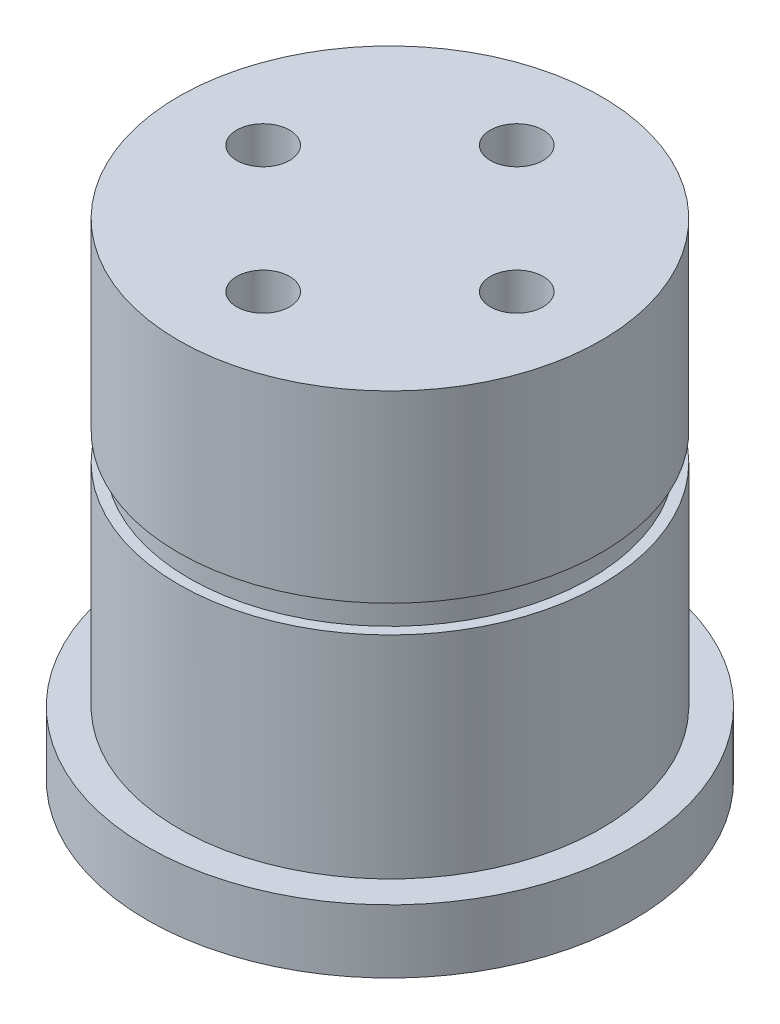
ISO-10303-21;
HEADER;
FILE_DESCRIPTION(('STEP AP214'),'2;1');
FILE_NAME('part.step','',(''),(''),'','','');
FILE_SCHEMA(('AUTOMOTIVE_DESIGN { 1 0 10303 214 1 1 1 1 }'));
ENDSEC;
DATA;
#1=APPLICATION_CONTEXT('core data for automotive mechanical design processes');
#2=APPLICATION_PROTOCOL_DEFINITION('international standard','automotive_design',2000,#1);
#3=PRODUCT_CONTEXT('',#1,'mechanical');
#4=PRODUCT('Part','Part','',(#3));
#5=PRODUCT_RELATED_PRODUCT_CATEGORY('part','',(#4));
#6=PRODUCT_DEFINITION_FORMATION('','',#4);
#7=PRODUCT_DEFINITION_CONTEXT('part definition',#1,'design');
#8=PRODUCT_DEFINITION('design','',#6,#7);
#9=PRODUCT_DEFINITION_SHAPE('','',#8);
#10=(LENGTH_UNIT() NAMED_UNIT(*) SI_UNIT(.MILLI.,.METRE.));
#11=(NAMED_UNIT(*) PLANE_ANGLE_UNIT() SI_UNIT($,.RADIAN.));
#12=(NAMED_UNIT(*) SI_UNIT($,.STERADIAN.) SOLID_ANGLE_UNIT());
#13=UNCERTAINTY_MEASURE_WITH_UNIT(LENGTH_MEASURE(1.E-05),#10,'distance_accuracy_value','');
#14=(GEOMETRIC_REPRESENTATION_CONTEXT(3) GLOBAL_UNCERTAINTY_ASSIGNED_CONTEXT((#13)) GLOBAL_UNIT_ASSIGNED_CONTEXT((#10,
#11,#12)) REPRESENTATION_CONTEXT('',''));
#15=CARTESIAN_POINT('',(0.,0.,0.));
#16=DIRECTION('',(0.,0.,1.));
#17=DIRECTION('',(1.,0.,0.));
#18=AXIS2_PLACEMENT_3D('',#15,#16,#17);
#19=CARTESIAN_POINT('',(0.,23.,0.));
#20=DIRECTION('',(0.,-1.,0.));
#21=DIRECTION('',(0.,0.,-1.));
#22=AXIS2_PLACEMENT_3D('',#19,#20,#21);
#23=CYLINDRICAL_SURFACE('',#22,10.);
#24=CARTESIAN_POINT('',(0.,14.3,0.));
#25=DIRECTION('',(0.,1.,0.));
#26=DIRECTION('',(0.,0.,1.));
#27=AXIS2_PLACEMENT_3D('',#24,#25,#26);
#28=CIRCLE('',#27,10.);
#29=CARTESIAN_POINT('',(0.,14.3,10.));
#30=VERTEX_POINT('',#29);
#31=EDGE_CURVE('E125',#30,#30,#28,.T.);
#32=ORIENTED_EDGE('',*,*,#31,.T.);
#33=EDGE_LOOP('',(#32));
#34=FACE_BOUND('',#33,.T.);
#35=CARTESIAN_POINT('',(0.,23.,0.));
#36=DIRECTION('',(0.,1.,0.));
#37=DIRECTION('',(0.,0.,1.));
#38=AXIS2_PLACEMENT_3D('',#35,#36,#37);
#39=CIRCLE('',#38,10.);
#40=CARTESIAN_POINT('',(0.,23.,10.));
#41=VERTEX_POINT('',#40);
#42=EDGE_CURVE('E48',#41,#41,#39,.T.);
#43=ORIENTED_EDGE('',*,*,#42,.F.);
#44=EDGE_LOOP('',(#43));
#45=FACE_BOUND('',#44,.T.);
#46=ADVANCED_FACE('F41',(#34,#45),#23,.T.);
#47=CARTESIAN_POINT('',(0.,23.,0.));
#48=DIRECTION('',(0.,1.,0.));
#49=DIRECTION('',(0.,0.,1.));
#50=AXIS2_PLACEMENT_3D('',#47,#48,#49);
#51=PLANE('',#50);
#52=CARTESIAN_POINT('',(0.,23.,-6.));
#53=DIRECTION('',(0.,1.,0.));
#54=DIRECTION('',(0.,0.,1.));
#55=AXIS2_PLACEMENT_3D('',#52,#53,#54);
#56=CIRCLE('',#55,1.24999999999999);
#57=CARTESIAN_POINT('',(0.,23.,-4.75000000000001));
#58=VERTEX_POINT('',#57);
#59=EDGE_CURVE('E72',#58,#58,#56,.T.);
#60=ORIENTED_EDGE('',*,*,#59,.F.);
#61=EDGE_LOOP('',(#60));
#62=FACE_BOUND('',#61,.T.);
#63=CARTESIAN_POINT('',(6.,23.,0.));
#64=DIRECTION('',(0.,1.,0.));
#65=DIRECTION('',(0.,0.,1.));
#66=AXIS2_PLACEMENT_3D('',#63,#64,#65);
#67=CIRCLE('',#66,1.24999999999999);
#68=CARTESIAN_POINT('',(6.,23.,1.24999999999999));
#69=VERTEX_POINT('',#68);
#70=EDGE_CURVE('E71',#69,#69,#67,.T.);
#71=ORIENTED_EDGE('',*,*,#70,.F.);
#72=EDGE_LOOP('',(#71));
#73=FACE_BOUND('',#72,.T.);
#74=CARTESIAN_POINT('',(0.,23.,6.));
#75=DIRECTION('',(0.,1.,0.));
#76=DIRECTION('',(0.,0.,1.));
#77=AXIS2_PLACEMENT_3D('',#74,#75,#76);
#78=CIRCLE('',#77,1.24999999999999);
#79=CARTESIAN_POINT('',(0.,23.,7.24999999999999));
#80=VERTEX_POINT('',#79);
#81=EDGE_CURVE('E84',#80,#80,#78,.T.);
#82=ORIENTED_EDGE('',*,*,#81,.F.);
#83=EDGE_LOOP('',(#82));
#84=FACE_BOUND('',#83,.T.);
#85=CARTESIAN_POINT('',(-6.,23.,0.));
#86=DIRECTION('',(0.,1.,0.));
#87=DIRECTION('',(0.,0.,1.));
#88=AXIS2_PLACEMENT_3D('',#85,#86,#87);
#89=CIRCLE('',#88,1.24999999999999);
#90=CARTESIAN_POINT('',(-6.,23.,1.24999999999999));
#91=VERTEX_POINT('',#90);
#92=EDGE_CURVE('E90',#91,#91,#89,.T.);
#93=ORIENTED_EDGE('',*,*,#92,.F.);
#94=EDGE_LOOP('',(#93));
#95=FACE_BOUND('',#94,.T.);
#96=ORIENTED_EDGE('',*,*,#42,.T.);
#97=EDGE_LOOP('',(#96));
#98=FACE_BOUND('',#97,.T.);
#99=ADVANCED_FACE('F98',(#62,#73,#84,#95,#98),#51,.T.);
#100=CARTESIAN_POINT('',(-6.,14.5,0.));
#101=DIRECTION('',(0.,1.,0.));
#102=DIRECTION('',(0.,0.,1.));
#103=AXIS2_PLACEMENT_3D('',#100,#101,#102);
#104=CONICAL_SURFACE('',#103,1.24999999999999,1.02974425867665);
#105=CARTESIAN_POINT('',(-6.,13.7489242262156,0.));
#106=VERTEX_POINT('',#105);
#107=VERTEX_LOOP('',#106);
#108=FACE_BOUND('',#107,.T.);
#109=CARTESIAN_POINT('',(-6.,14.5,0.));
#110=DIRECTION('',(0.,1.,0.));
#111=DIRECTION('',(0.,0.,1.));
#112=AXIS2_PLACEMENT_3D('',#109,#110,#111);
#113=CIRCLE('',#112,1.24999999999999);
#114=CARTESIAN_POINT('',(-6.,14.5,1.24999999999999));
#115=VERTEX_POINT('',#114);
#116=EDGE_CURVE('E93',#115,#115,#113,.T.);
#117=ORIENTED_EDGE('',*,*,#116,.T.);
#118=EDGE_LOOP('',(#117));
#119=FACE_BOUND('',#118,.T.);
#120=ADVANCED_FACE('F106',(#108,#119),#104,.F.);
#121=CARTESIAN_POINT('',(-6.,23.,0.));
#122=DIRECTION('',(0.,1.,0.));
#123=DIRECTION('',(0.,0.,1.));
#124=AXIS2_PLACEMENT_3D('',#121,#122,#123);
#125=CYLINDRICAL_SURFACE('',#124,1.24999999999999);
#126=ORIENTED_EDGE('',*,*,#116,.F.);
#127=EDGE_LOOP('',(#126));
#128=FACE_BOUND('',#127,.T.);
#129=ORIENTED_EDGE('',*,*,#92,.T.);
#130=EDGE_LOOP('',(#129));
#131=FACE_BOUND('',#130,.T.);
#132=ADVANCED_FACE('F155',(#128,#131),#125,.F.);
#133=CARTESIAN_POINT('',(0.,14.5,6.));
#134=DIRECTION('',(0.,1.,0.));
#135=DIRECTION('',(0.,0.,1.));
#136=AXIS2_PLACEMENT_3D('',#133,#134,#135);
#137=CONICAL_SURFACE('',#136,1.24999999999999,1.02974425867665);
#138=CARTESIAN_POINT('',(0.,13.7489242262156,6.));
#139=VERTEX_POINT('',#138);
#140=VERTEX_LOOP('',#139);
#141=FACE_BOUND('',#140,.T.);
#142=CARTESIAN_POINT('',(0.,14.5,6.));
#143=DIRECTION('',(0.,1.,0.));
#144=DIRECTION('',(0.,0.,1.));
#145=AXIS2_PLACEMENT_3D('',#142,#143,#144);
#146=CIRCLE('',#145,1.24999999999999);
#147=CARTESIAN_POINT('',(0.,14.5,7.24999999999999));
#148=VERTEX_POINT('',#147);
#149=EDGE_CURVE('E87',#148,#148,#146,.T.);
#150=ORIENTED_EDGE('',*,*,#149,.T.);
#151=EDGE_LOOP('',(#150));
#152=FACE_BOUND('',#151,.T.);
#153=ADVANCED_FACE('F158',(#141,#152),#137,.F.);
#154=CARTESIAN_POINT('',(0.,23.,6.));
#155=DIRECTION('',(0.,1.,0.));
#156=DIRECTION('',(0.,0.,1.));
#157=AXIS2_PLACEMENT_3D('',#154,#155,#156);
#158=CYLINDRICAL_SURFACE('',#157,1.24999999999999);
#159=ORIENTED_EDGE('',*,*,#149,.F.);
#160=EDGE_LOOP('',(#159));
#161=FACE_BOUND('',#160,.T.);
#162=ORIENTED_EDGE('',*,*,#81,.T.);
#163=EDGE_LOOP('',(#162));
#164=FACE_BOUND('',#163,.T.);
#165=ADVANCED_FACE('F162',(#161,#164),#158,.F.);
#166=CARTESIAN_POINT('',(6.,14.5,0.));
#167=DIRECTION('',(0.,1.,0.));
#168=DIRECTION('',(0.,0.,1.));
#169=AXIS2_PLACEMENT_3D('',#166,#167,#168);
#170=CONICAL_SURFACE('',#169,1.24999999999999,1.02974425867665);
#171=CARTESIAN_POINT('',(6.,13.7489242262156,0.));
#172=VERTEX_POINT('',#171);
#173=VERTEX_LOOP('',#172);
#174=FACE_BOUND('',#173,.T.);
#175=CARTESIAN_POINT('',(6.,14.5,0.));
#176=DIRECTION('',(0.,1.,0.));
#177=DIRECTION('',(0.,0.,1.));
#178=AXIS2_PLACEMENT_3D('',#175,#176,#177);
#179=CIRCLE('',#178,1.24999999999999);
#180=CARTESIAN_POINT('',(6.,14.5,1.24999999999999));
#181=VERTEX_POINT('',#180);
#182=EDGE_CURVE('E75',#181,#181,#179,.T.);
#183=ORIENTED_EDGE('',*,*,#182,.T.);
#184=EDGE_LOOP('',(#183));
#185=FACE_BOUND('',#184,.T.);
#186=ADVANCED_FACE('F165',(#174,#185),#170,.F.);
#187=CARTESIAN_POINT('',(6.,23.,0.));
#188=DIRECTION('',(0.,1.,0.));
#189=DIRECTION('',(0.,0.,1.));
#190=AXIS2_PLACEMENT_3D('',#187,#188,#189);
#191=CYLINDRICAL_SURFACE('',#190,1.24999999999999);
#192=ORIENTED_EDGE('',*,*,#182,.F.);
#193=EDGE_LOOP('',(#192));
#194=FACE_BOUND('',#193,.T.);
#195=ORIENTED_EDGE('',*,*,#70,.T.);
#196=EDGE_LOOP('',(#195));
#197=FACE_BOUND('',#196,.T.);
#198=ADVANCED_FACE('F65',(#194,#197),#191,.F.);
#199=CARTESIAN_POINT('',(0.,14.5,-6.));
#200=DIRECTION('',(0.,1.,0.));
#201=DIRECTION('',(0.,0.,1.));
#202=AXIS2_PLACEMENT_3D('',#199,#200,#201);
#203=CONICAL_SURFACE('',#202,1.24999999999999,1.02974425867665);
#204=CARTESIAN_POINT('',(0.,13.7489242262156,-6.));
#205=VERTEX_POINT('',#204);
#206=VERTEX_LOOP('',#205);
#207=FACE_BOUND('',#206,.T.);
#208=CARTESIAN_POINT('',(0.,14.5,-6.));
#209=DIRECTION('',(0.,1.,0.));
#210=DIRECTION('',(0.,0.,1.));
#211=AXIS2_PLACEMENT_3D('',#208,#209,#210);
#212=CIRCLE('',#211,1.24999999999999);
#213=CARTESIAN_POINT('',(0.,14.5,-4.75000000000001));
#214=VERTEX_POINT('',#213);
#215=EDGE_CURVE('E69',#214,#214,#212,.T.);
#216=ORIENTED_EDGE('',*,*,#215,.T.);
#217=EDGE_LOOP('',(#216));
#218=FACE_BOUND('',#217,.T.);
#219=ADVANCED_FACE('F61',(#207,#218),#203,.F.);
#220=CARTESIAN_POINT('',(0.,23.,-6.));
#221=DIRECTION('',(0.,1.,0.));
#222=DIRECTION('',(0.,0.,1.));
#223=AXIS2_PLACEMENT_3D('',#220,#221,#222);
#224=CYLINDRICAL_SURFACE('',#223,1.24999999999999);
#225=ORIENTED_EDGE('',*,*,#215,.F.);
#226=EDGE_LOOP('',(#225));
#227=FACE_BOUND('',#226,.T.);
#228=ORIENTED_EDGE('',*,*,#59,.T.);
#229=EDGE_LOOP('',(#228));
#230=FACE_BOUND('',#229,.T.);
#231=ADVANCED_FACE('F64',(#227,#230),#224,.F.);
#232=CARTESIAN_POINT('',(0.,14.3,0.));
#233=DIRECTION('',(0.,1.,0.));
#234=DIRECTION('',(0.,0.,1.));
#235=AXIS2_PLACEMENT_3D('',#232,#233,#234);
#236=PLANE('',#235);
#237=ORIENTED_EDGE('',*,*,#31,.F.);
#238=EDGE_LOOP('',(#237));
#239=FACE_BOUND('',#238,.T.);
#240=CARTESIAN_POINT('',(0.,14.3,0.));
#241=DIRECTION('',(0.,1.,0.));
#242=DIRECTION('',(0.,0.,1.));
#243=AXIS2_PLACEMENT_3D('',#240,#241,#242);
#244=CIRCLE('',#243,9.5);
#245=CARTESIAN_POINT('',(0.,14.3,9.5));
#246=VERTEX_POINT('',#245);
#247=EDGE_CURVE('E126',#246,#246,#244,.T.);
#248=ORIENTED_EDGE('',*,*,#247,.T.);
#249=EDGE_LOOP('',(#248));
#250=FACE_BOUND('',#249,.T.);
#251=ADVANCED_FACE('F174',(#239,#250),#236,.F.);
#252=CARTESIAN_POINT('',(0.,13.,0.));
#253=DIRECTION('',(0.,1.,0.));
#254=DIRECTION('',(0.,0.,1.));
#255=AXIS2_PLACEMENT_3D('',#252,#253,#254);
#256=PLANE('',#255);
#257=CARTESIAN_POINT('',(0.,13.,0.));
#258=DIRECTION('',(0.,1.,0.));
#259=DIRECTION('',(0.,0.,1.));
#260=AXIS2_PLACEMENT_3D('',#257,#258,#259);
#261=CIRCLE('',#260,10.);
#262=CARTESIAN_POINT('',(0.,13.,10.));
#263=VERTEX_POINT('',#262);
#264=EDGE_CURVE('E123',#263,#263,#261,.T.);
#265=ORIENTED_EDGE('',*,*,#264,.T.);
#266=EDGE_LOOP('',(#265));
#267=FACE_BOUND('',#266,.T.);
#268=CARTESIAN_POINT('',(0.,13.,0.));
#269=DIRECTION('',(0.,1.,0.));
#270=DIRECTION('',(0.,0.,1.));
#271=AXIS2_PLACEMENT_3D('',#268,#269,#270);
#272=CIRCLE('',#271,9.5);
#273=CARTESIAN_POINT('',(0.,13.,9.5));
#274=VERTEX_POINT('',#273);
#275=EDGE_CURVE('E131',#274,#274,#272,.T.);
#276=ORIENTED_EDGE('',*,*,#275,.F.);
#277=EDGE_LOOP('',(#276));
#278=FACE_BOUND('',#277,.T.);
#279=ADVANCED_FACE('F149',(#267,#278),#256,.T.);
#280=CARTESIAN_POINT('',(0.,14.3,0.));
#281=DIRECTION('',(0.,-1.,0.));
#282=DIRECTION('',(0.,0.,-1.));
#283=AXIS2_PLACEMENT_3D('',#280,#281,#282);
#284=CYLINDRICAL_SURFACE('',#283,9.5);
#285=ORIENTED_EDGE('',*,*,#247,.F.);
#286=EDGE_LOOP('',(#285));
#287=FACE_BOUND('',#286,.T.);
#288=ORIENTED_EDGE('',*,*,#275,.T.);
#289=EDGE_LOOP('',(#288));
#290=FACE_BOUND('',#289,.T.);
#291=ADVANCED_FACE('F143',(#287,#290),#284,.T.);
#292=CARTESIAN_POINT('',(0.,0.,0.));
#293=DIRECTION('',(0.,1.,0.));
#294=DIRECTION('',(0.,0.,1.));
#295=AXIS2_PLACEMENT_3D('',#292,#293,#294);
#296=PLANE('',#295);
#297=CARTESIAN_POINT('',(0.,0.,0.));
#298=DIRECTION('',(0.,1.,0.));
#299=DIRECTION('',(0.,0.,1.));
#300=AXIS2_PLACEMENT_3D('',#297,#298,#299);
#301=CIRCLE('',#300,11.5);
#302=CARTESIAN_POINT('',(0.,0.,11.5));
#303=VERTEX_POINT('',#302);
#304=EDGE_CURVE('E128',#303,#303,#301,.T.);
#305=ORIENTED_EDGE('',*,*,#304,.F.);
#306=EDGE_LOOP('',(#305));
#307=FACE_BOUND('',#306,.T.);
#308=ADVANCED_FACE('F141',(#307),#296,.F.);
#309=CARTESIAN_POINT('',(0.,-32.5269119345812,0.));
#310=DIRECTION('',(0.,1.,0.));
#311=DIRECTION('',(0.,0.,1.));
#312=AXIS2_PLACEMENT_3D('',#309,#310,#311);
#313=CYLINDRICAL_SURFACE('',#312,11.5);
#314=CARTESIAN_POINT('',(0.,3.,0.));
#315=DIRECTION('',(0.,-1.,0.));
#316=DIRECTION('',(0.,0.,-1.));
#317=AXIS2_PLACEMENT_3D('',#314,#315,#316);
#318=CIRCLE('',#317,11.5);
#319=CARTESIAN_POINT('',(0.,3.,11.5));
#320=VERTEX_POINT('',#319);
#321=EDGE_CURVE('E78',#320,#320,#318,.T.);
#322=CARTESIAN_POINT('',(0.,0.,11.5));
#323=CARTESIAN_POINT('',(0.,0.0312499999999942,11.5));
#324=CARTESIAN_POINT('',(0.,0.0624999999999954,11.5));
#325=CARTESIAN_POINT('',(0.,0.124999999999995,11.5));
#326=CARTESIAN_POINT('',(0.,0.156249999999994,11.5));
#327=CARTESIAN_POINT('',(0.,0.218749999999992,11.5));
#328=CARTESIAN_POINT('',(0.,0.249999999999991,11.5));
#329=CARTESIAN_POINT('',(0.,0.312499999999991,11.5));
#330=CARTESIAN_POINT('',(0.,0.343749999999992,11.5));
#331=CARTESIAN_POINT('',(0.,0.406249999999995,11.5));
#332=CARTESIAN_POINT('',(0.,0.437499999999996,11.5));
#333=CARTESIAN_POINT('',(0.,0.499999999999996,11.5));
#334=CARTESIAN_POINT('',(0.,0.531249999999995,11.5));
#335=CARTESIAN_POINT('',(0.,0.593749999999992,11.5));
#336=CARTESIAN_POINT('',(0.,0.624999999999991,11.5));
#337=CARTESIAN_POINT('',(0.,0.687499999999991,11.5));
#338=CARTESIAN_POINT('',(0.,0.718749999999993,11.5));
#339=CARTESIAN_POINT('',(0.,0.781249999999995,11.5));
#340=CARTESIAN_POINT('',(0.,0.812499999999996,11.5));
#341=CARTESIAN_POINT('',(0.,0.874999999999996,11.5));
#342=CARTESIAN_POINT('',(0.,0.906249999999995,11.5));
#343=CARTESIAN_POINT('',(0.,0.968749999999993,11.5));
#344=CARTESIAN_POINT('',(0.,0.999999999999992,11.5));
#345=CARTESIAN_POINT('',(0.,1.06249999999999,11.5));
#346=CARTESIAN_POINT('',(0.,1.09374999999999,11.5));
#347=CARTESIAN_POINT('',(0.,1.15625,11.5));
#348=CARTESIAN_POINT('',(0.,1.1875,11.5));
#349=CARTESIAN_POINT('',(0.,1.25,11.5));
#350=CARTESIAN_POINT('',(0.,1.28125,11.5));
#351=CARTESIAN_POINT('',(0.,1.34374999999999,11.5));
#352=CARTESIAN_POINT('',(0.,1.37499999999999,11.5));
#353=CARTESIAN_POINT('',(0.,1.43749999999999,11.5));
#354=CARTESIAN_POINT('',(0.,1.46874999999999,11.5));
#355=CARTESIAN_POINT('',(0.,1.53125,11.5));
#356=CARTESIAN_POINT('',(0.,1.5625,11.5));
#357=CARTESIAN_POINT('',(0.,1.625,11.5));
#358=CARTESIAN_POINT('',(0.,1.65625,11.5));
#359=CARTESIAN_POINT('',(0.,1.71874999999999,11.5));
#360=CARTESIAN_POINT('',(0.,1.74999999999999,11.5));
#361=CARTESIAN_POINT('',(0.,1.81249999999999,11.5));
#362=CARTESIAN_POINT('',(0.,1.84374999999999,11.5));
#363=CARTESIAN_POINT('',(0.,1.90625,11.5));
#364=CARTESIAN_POINT('',(0.,1.9375,11.5));
#365=CARTESIAN_POINT('',(0.,2.,11.5));
#366=CARTESIAN_POINT('',(0.,2.03125,11.5));
#367=CARTESIAN_POINT('',(0.,2.09374999999999,11.5));
#368=CARTESIAN_POINT('',(0.,2.12499999999999,11.5));
#369=CARTESIAN_POINT('',(0.,2.18749999999999,11.5));
#370=CARTESIAN_POINT('',(0.,2.21874999999999,11.5));
#371=CARTESIAN_POINT('',(0.,2.28125,11.5));
#372=CARTESIAN_POINT('',(0.,2.3125,11.5));
#373=CARTESIAN_POINT('',(0.,2.375,11.5));
#374=CARTESIAN_POINT('',(0.,2.40625,11.5));
#375=CARTESIAN_POINT('',(0.,2.46874999999999,11.5));
#376=CARTESIAN_POINT('',(0.,2.49999999999999,11.5));
#377=CARTESIAN_POINT('',(0.,2.56249999999999,11.5));
#378=CARTESIAN_POINT('',(0.,2.59374999999999,11.5));
#379=CARTESIAN_POINT('',(0.,2.65625,11.5));
#380=CARTESIAN_POINT('',(0.,2.6875,11.5));
#381=CARTESIAN_POINT('',(0.,2.75,11.5));
#382=CARTESIAN_POINT('',(0.,2.78125,11.5));
#383=CARTESIAN_POINT('',(0.,2.84374999999999,11.5));
#384=CARTESIAN_POINT('',(0.,2.87499999999999,11.5));
#385=CARTESIAN_POINT('',(0.,2.93749999999999,11.5));
#386=CARTESIAN_POINT('',(0.,2.96874999999999,11.5));
#387=CARTESIAN_POINT('',(0.,3.,11.5));
#388=B_SPLINE_CURVE_WITH_KNOTS('',3,(#322,#323,#324,#325,#326,#327,#328,#329,#330,#331,#332,
#333,#334,#335,#336,#337,#338,#339,#340,#341,#342,#343,#344,#345,#346,#347,#348,#349,#350,#351,
#352,#353,#354,#355,#356,#357,#358,#359,#360,#361,#362,#363,#364,#365,#366,#367,#368,#369,#370,
#371,#372,#373,#374,#375,#376,#377,#378,#379,#380,#381,#382,#383,#384,#385,#386,#387),
.UNSPECIFIED.,.F.,.F.,(4,2,2,2,2,2,2,2,2,2,2,2,2,2,2,2,2,2,2,2,2,2,2,2,2,2,2,2,2,2,2,2,4),(0.,
0.0937500000000036,0.1875,0.281249999999997,0.375,0.468750000000004,0.5625,0.656249999999997,
0.750000000000001,0.843750000000004,0.937500000000001,1.03125,1.125,1.21875,1.3125,1.40625,1.5,
1.59375,1.6875,1.78125,1.875,1.96875000000001,2.0625,2.15625,2.25,2.34375000000001,2.4375,
2.53125,2.625,2.71875000000001,2.8125,2.90625,3.),.UNSPECIFIED.);
#389=EDGE_CURVE('BSEAM116',#303,#320,#388,.T.);
#390=ORIENTED_EDGE('',*,*,#304,.T.);
#391=ORIENTED_EDGE('',*,*,#321,.T.);
#392=ORIENTED_EDGE('',*,*,#389,.T.);
#393=ORIENTED_EDGE('',*,*,#389,.F.);
#394=EDGE_LOOP('',(#390,#392,#391,#393));
#395=FACE_BOUND('',#394,.T.);
#396=ADVANCED_FACE('F116',(#395),#313,.T.);
#397=CARTESIAN_POINT('',(0.,3.,0.));
#398=DIRECTION('',(0.,-1.,0.));
#399=DIRECTION('',(0.,0.,-1.));
#400=AXIS2_PLACEMENT_3D('',#397,#398,#399);
#401=PLANE('',#400);
#402=ORIENTED_EDGE('',*,*,#321,.F.);
#403=EDGE_LOOP('',(#402));
#404=FACE_BOUND('',#403,.T.);
#405=CARTESIAN_POINT('',(0.,3.,0.));
#406=DIRECTION('',(0.,-1.,0.));
#407=DIRECTION('',(0.,0.,-1.));
#408=AXIS2_PLACEMENT_3D('',#405,#406,#407);
#409=CIRCLE('',#408,10.);
#410=CARTESIAN_POINT('',(0.,3.,-10.));
#411=VERTEX_POINT('',#410);
#412=EDGE_CURVE('E11',#411,#411,#409,.T.);
#413=ORIENTED_EDGE('',*,*,#412,.T.);
#414=EDGE_LOOP('',(#413));
#415=FACE_BOUND('',#414,.T.);
#416=ADVANCED_FACE('F111',(#404,#415),#401,.F.);
#417=ORIENTED_EDGE('',*,*,#412,.F.);
#418=EDGE_LOOP('',(#417));
#419=FACE_BOUND('',#418,.T.);
#420=ORIENTED_EDGE('',*,*,#264,.F.);
#421=EDGE_LOOP('',(#420));
#422=FACE_BOUND('',#421,.T.);
#423=ADVANCED_FACE('F102',(#419,#422),#23,.T.);
#424=CLOSED_SHELL('',(#46,#99,#120,#132,#153,#165,#186,#198,#219,#231,#251,#279,#291,#308,#396,
#416,#423));
#425=MANIFOLD_SOLID_BREP('B2',#424);
#426=ADVANCED_BREP_SHAPE_REPRESENTATION('',(#18,#425),#14);
#427=SHAPE_DEFINITION_REPRESENTATION(#9,#426);
ENDSEC;
END-ISO-10303-21;
